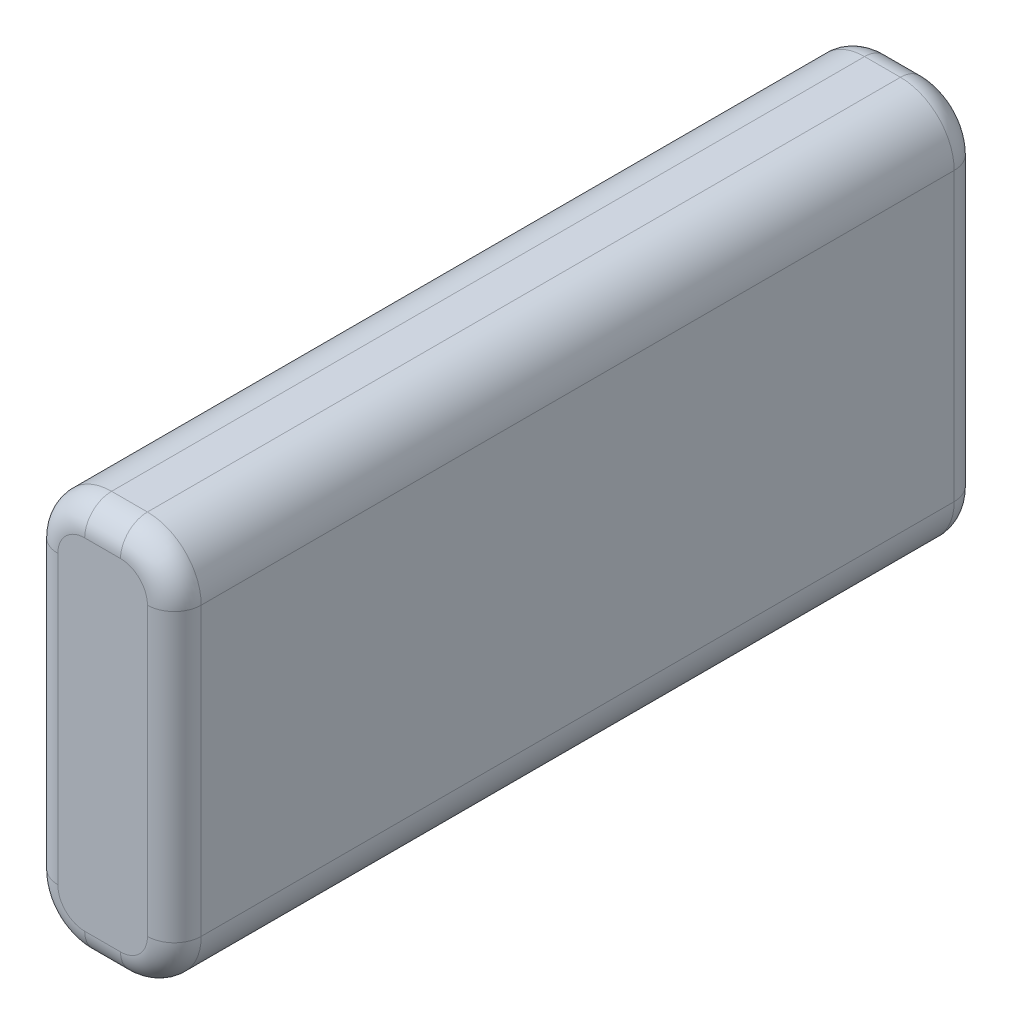
ISO-10303-21;
HEADER;
FILE_DESCRIPTION(('STEP AP214'),'2;1');
FILE_NAME('part.step','',(''),(''),'','','');
FILE_SCHEMA(('AUTOMOTIVE_DESIGN { 1 0 10303 214 1 1 1 1 }'));
ENDSEC;
DATA;
#1=APPLICATION_CONTEXT('core data for automotive mechanical design processes');
#2=APPLICATION_PROTOCOL_DEFINITION('international standard','automotive_design',2000,#1);
#3=PRODUCT_CONTEXT('',#1,'mechanical');
#4=PRODUCT('Part','Part','',(#3));
#5=PRODUCT_RELATED_PRODUCT_CATEGORY('part','',(#4));
#6=PRODUCT_DEFINITION_FORMATION('','',#4);
#7=PRODUCT_DEFINITION_CONTEXT('part definition',#1,'design');
#8=PRODUCT_DEFINITION('design','',#6,#7);
#9=PRODUCT_DEFINITION_SHAPE('','',#8);
#10=(LENGTH_UNIT() NAMED_UNIT(*) SI_UNIT(.MILLI.,.METRE.));
#11=(NAMED_UNIT(*) PLANE_ANGLE_UNIT() SI_UNIT($,.RADIAN.));
#12=(NAMED_UNIT(*) SI_UNIT($,.STERADIAN.) SOLID_ANGLE_UNIT());
#13=UNCERTAINTY_MEASURE_WITH_UNIT(LENGTH_MEASURE(1.E-05),#10,'distance_accuracy_value','');
#14=(GEOMETRIC_REPRESENTATION_CONTEXT(3) GLOBAL_UNCERTAINTY_ASSIGNED_CONTEXT((#13)) GLOBAL_UNIT_ASSIGNED_CONTEXT((#10,
#11,#12)) REPRESENTATION_CONTEXT('',''));
#15=CARTESIAN_POINT('',(0.,0.,0.));
#16=DIRECTION('',(0.,0.,1.));
#17=DIRECTION('',(1.,0.,0.));
#18=AXIS2_PLACEMENT_3D('',#15,#16,#17);
#19=CARTESIAN_POINT('',(-2.,-16.,45.));
#20=DIRECTION('',(0.,0.,-1.));
#21=DIRECTION('',(-1.,0.,0.));
#22=AXIS2_PLACEMENT_3D('',#19,#20,#21);
#23=CYLINDRICAL_SURFACE('',#22,6.);
#24=DIRECTION('',(0.,0.,-1.));
#25=VECTOR('',#24,1.);
#26=CARTESIAN_POINT('',(-2.,-22.,45.));
#27=LINE('',#26,#25);
#28=CARTESIAN_POINT('',(-2.,-22.,42.));
#29=VERTEX_POINT('',#28);
#30=CARTESIAN_POINT('',(-2.,-22.,-42.));
#31=VERTEX_POINT('',#30);
#32=EDGE_CURVE('E173',#29,#31,#27,.T.);
#33=ORIENTED_EDGE('',*,*,#32,.F.);
#34=CARTESIAN_POINT('',(-2.,-16.,42.));
#35=DIRECTION('',(0.,0.,1.));
#36=DIRECTION('',(1.,0.,0.));
#37=AXIS2_PLACEMENT_3D('',#34,#35,#36);
#38=CIRCLE('',#37,6.);
#39=CARTESIAN_POINT('',(-8.,-16.,42.));
#40=VERTEX_POINT('',#39);
#41=EDGE_CURVE('E165',#29,#40,#38,.F.);
#42=ORIENTED_EDGE('',*,*,#41,.T.);
#43=DIRECTION('',(0.,0.,-1.));
#44=VECTOR('',#43,1.);
#45=CARTESIAN_POINT('',(-8.,-16.,45.));
#46=LINE('',#45,#44);
#47=CARTESIAN_POINT('',(-8.,-16.,-42.));
#48=VERTEX_POINT('',#47);
#49=EDGE_CURVE('E255',#40,#48,#46,.T.);
#50=ORIENTED_EDGE('',*,*,#49,.T.);
#51=CARTESIAN_POINT('',(-2.,-16.,-42.));
#52=DIRECTION('',(0.,0.,1.));
#53=DIRECTION('',(1.,0.,0.));
#54=AXIS2_PLACEMENT_3D('',#51,#52,#53);
#55=CIRCLE('',#54,6.);
#56=EDGE_CURVE('E194',#48,#31,#55,.T.);
#57=ORIENTED_EDGE('',*,*,#56,.T.);
#58=EDGE_LOOP('',(#33,#42,#50,#57));
#59=FACE_BOUND('',#58,.T.);
#60=ADVANCED_FACE('F39',(#59),#23,.T.);
#61=CARTESIAN_POINT('',(-2.,-22.,45.));
#62=DIRECTION('',(0.,1.,0.));
#63=DIRECTION('',(0.,0.,1.));
#64=AXIS2_PLACEMENT_3D('',#61,#62,#63);
#65=PLANE('',#64);
#66=ORIENTED_EDGE('',*,*,#32,.T.);
#67=DIRECTION('',(1.,0.,0.));
#68=VECTOR('',#67,1.);
#69=CARTESIAN_POINT('',(-2.,-22.,-42.));
#70=LINE('',#69,#68);
#71=CARTESIAN_POINT('',(2.,-22.,-42.));
#72=VERTEX_POINT('',#71);
#73=EDGE_CURVE('E227',#31,#72,#70,.T.);
#74=ORIENTED_EDGE('',*,*,#73,.T.);
#75=DIRECTION('',(0.,0.,-1.));
#76=VECTOR('',#75,1.);
#77=CARTESIAN_POINT('',(2.,-22.,45.));
#78=LINE('',#77,#76);
#79=CARTESIAN_POINT('',(2.,-22.,42.));
#80=VERTEX_POINT('',#79);
#81=EDGE_CURVE('E309',#80,#72,#78,.T.);
#82=ORIENTED_EDGE('',*,*,#81,.F.);
#83=DIRECTION('',(1.,0.,0.));
#84=VECTOR('',#83,1.);
#85=CARTESIAN_POINT('',(-2.,-22.,42.));
#86=LINE('',#85,#84);
#87=EDGE_CURVE('E221',#80,#29,#86,.F.);
#88=ORIENTED_EDGE('',*,*,#87,.T.);
#89=EDGE_LOOP('',(#66,#74,#82,#88));
#90=FACE_BOUND('',#89,.T.);
#91=ADVANCED_FACE('F321',(#90),#65,.F.);
#92=CARTESIAN_POINT('',(2.,-16.,45.));
#93=DIRECTION('',(0.,0.,-1.));
#94=DIRECTION('',(-1.,0.,0.));
#95=AXIS2_PLACEMENT_3D('',#92,#93,#94);
#96=CYLINDRICAL_SURFACE('',#95,6.);
#97=DIRECTION('',(0.,0.,-1.));
#98=VECTOR('',#97,1.);
#99=CARTESIAN_POINT('',(8.,-16.,45.));
#100=LINE('',#99,#98);
#101=CARTESIAN_POINT('',(8.,-16.,42.));
#102=VERTEX_POINT('',#101);
#103=CARTESIAN_POINT('',(8.,-16.,-42.));
#104=VERTEX_POINT('',#103);
#105=EDGE_CURVE('E302',#102,#104,#100,.T.);
#106=ORIENTED_EDGE('',*,*,#105,.F.);
#107=CARTESIAN_POINT('',(2.,-16.,42.));
#108=DIRECTION('',(0.,0.,1.));
#109=DIRECTION('',(1.,0.,0.));
#110=AXIS2_PLACEMENT_3D('',#107,#108,#109);
#111=CIRCLE('',#110,6.);
#112=EDGE_CURVE('E210',#102,#80,#111,.F.);
#113=ORIENTED_EDGE('',*,*,#112,.T.);
#114=ORIENTED_EDGE('',*,*,#81,.T.);
#115=CARTESIAN_POINT('',(2.,-16.,-42.));
#116=DIRECTION('',(0.,0.,1.));
#117=DIRECTION('',(1.,0.,0.));
#118=AXIS2_PLACEMENT_3D('',#115,#116,#117);
#119=CIRCLE('',#118,6.);
#120=EDGE_CURVE('E202',#72,#104,#119,.T.);
#121=ORIENTED_EDGE('',*,*,#120,.T.);
#122=EDGE_LOOP('',(#106,#113,#114,#121));
#123=FACE_BOUND('',#122,.T.);
#124=ADVANCED_FACE('F362',(#123),#96,.T.);
#125=CARTESIAN_POINT('',(8.,-16.,45.));
#126=DIRECTION('',(-1.,0.,0.));
#127=DIRECTION('',(0.,0.,1.));
#128=AXIS2_PLACEMENT_3D('',#125,#126,#127);
#129=PLANE('',#128);
#130=DIRECTION('',(0.,0.,-1.));
#131=VECTOR('',#130,1.);
#132=CARTESIAN_POINT('',(8.,16.,45.));
#133=LINE('',#132,#131);
#134=CARTESIAN_POINT('',(8.,16.,42.));
#135=VERTEX_POINT('',#134);
#136=CARTESIAN_POINT('',(8.,16.,-42.));
#137=VERTEX_POINT('',#136);
#138=EDGE_CURVE('E296',#135,#137,#133,.T.);
#139=ORIENTED_EDGE('',*,*,#138,.F.);
#140=DIRECTION('',(0.,1.,0.));
#141=VECTOR('',#140,1.);
#142=CARTESIAN_POINT('',(8.,-16.,42.));
#143=LINE('',#142,#141);
#144=EDGE_CURVE('E233',#135,#102,#143,.F.);
#145=ORIENTED_EDGE('',*,*,#144,.T.);
#146=ORIENTED_EDGE('',*,*,#105,.T.);
#147=DIRECTION('',(0.,1.,0.));
#148=VECTOR('',#147,1.);
#149=CARTESIAN_POINT('',(8.,-16.,-42.));
#150=LINE('',#149,#148);
#151=EDGE_CURVE('E232',#104,#137,#150,.T.);
#152=ORIENTED_EDGE('',*,*,#151,.T.);
#153=EDGE_LOOP('',(#139,#145,#146,#152));
#154=FACE_BOUND('',#153,.T.);
#155=ADVANCED_FACE('F299',(#154),#129,.F.);
#156=CARTESIAN_POINT('',(2.,16.,45.));
#157=DIRECTION('',(0.,0.,-1.));
#158=DIRECTION('',(-1.,0.,0.));
#159=AXIS2_PLACEMENT_3D('',#156,#157,#158);
#160=CYLINDRICAL_SURFACE('',#159,6.);
#161=DIRECTION('',(0.,0.,-1.));
#162=VECTOR('',#161,1.);
#163=CARTESIAN_POINT('',(2.,22.,45.));
#164=LINE('',#163,#162);
#165=CARTESIAN_POINT('',(2.,22.,42.));
#166=VERTEX_POINT('',#165);
#167=CARTESIAN_POINT('',(2.,22.,-42.));
#168=VERTEX_POINT('',#167);
#169=EDGE_CURVE('E306',#166,#168,#164,.T.);
#170=ORIENTED_EDGE('',*,*,#169,.F.);
#171=CARTESIAN_POINT('',(2.,16.,42.));
#172=DIRECTION('',(0.,0.,1.));
#173=DIRECTION('',(1.,0.,0.));
#174=AXIS2_PLACEMENT_3D('',#171,#172,#173);
#175=CIRCLE('',#174,6.);
#176=EDGE_CURVE('E201',#166,#135,#175,.F.);
#177=ORIENTED_EDGE('',*,*,#176,.T.);
#178=ORIENTED_EDGE('',*,*,#138,.T.);
#179=CARTESIAN_POINT('',(2.,16.,-42.));
#180=DIRECTION('',(0.,0.,1.));
#181=DIRECTION('',(1.,0.,0.));
#182=AXIS2_PLACEMENT_3D('',#179,#180,#181);
#183=CIRCLE('',#182,6.);
#184=EDGE_CURVE('E199',#137,#168,#183,.T.);
#185=ORIENTED_EDGE('',*,*,#184,.T.);
#186=EDGE_LOOP('',(#170,#177,#178,#185));
#187=FACE_BOUND('',#186,.T.);
#188=ADVANCED_FACE('F305',(#187),#160,.T.);
#189=CARTESIAN_POINT('',(2.,22.,45.));
#190=DIRECTION('',(0.,-1.,0.));
#191=DIRECTION('',(0.,0.,-1.));
#192=AXIS2_PLACEMENT_3D('',#189,#190,#191);
#193=PLANE('',#192);
#194=DIRECTION('',(0.,0.,-1.));
#195=VECTOR('',#194,1.);
#196=CARTESIAN_POINT('',(-2.,22.,45.));
#197=LINE('',#196,#195);
#198=CARTESIAN_POINT('',(-2.,22.,42.));
#199=VERTEX_POINT('',#198);
#200=CARTESIAN_POINT('',(-2.,22.,-42.));
#201=VERTEX_POINT('',#200);
#202=EDGE_CURVE('E315',#199,#201,#197,.T.);
#203=ORIENTED_EDGE('',*,*,#202,.F.);
#204=DIRECTION('',(-1.,0.,0.));
#205=VECTOR('',#204,1.);
#206=CARTESIAN_POINT('',(2.,22.,42.));
#207=LINE('',#206,#205);
#208=EDGE_CURVE('E11',#199,#166,#207,.F.);
#209=ORIENTED_EDGE('',*,*,#208,.T.);
#210=ORIENTED_EDGE('',*,*,#169,.T.);
#211=DIRECTION('',(-1.,0.,0.));
#212=VECTOR('',#211,1.);
#213=CARTESIAN_POINT('',(2.,22.,-42.));
#214=LINE('',#213,#212);
#215=EDGE_CURVE('E48',#168,#201,#214,.T.);
#216=ORIENTED_EDGE('',*,*,#215,.T.);
#217=EDGE_LOOP('',(#203,#209,#210,#216));
#218=FACE_BOUND('',#217,.T.);
#219=ADVANCED_FACE('F528',(#218),#193,.F.);
#220=CARTESIAN_POINT('',(-2.,16.,45.));
#221=DIRECTION('',(0.,0.,-1.));
#222=DIRECTION('',(-1.,0.,0.));
#223=AXIS2_PLACEMENT_3D('',#220,#221,#222);
#224=CYLINDRICAL_SURFACE('',#223,6.);
#225=DIRECTION('',(0.,0.,-1.));
#226=VECTOR('',#225,1.);
#227=CARTESIAN_POINT('',(-8.,16.,45.));
#228=LINE('',#227,#226);
#229=CARTESIAN_POINT('',(-8.,16.,42.));
#230=VERTEX_POINT('',#229);
#231=CARTESIAN_POINT('',(-8.,16.,-42.));
#232=VERTEX_POINT('',#231);
#233=EDGE_CURVE('E330',#230,#232,#228,.T.);
#234=ORIENTED_EDGE('',*,*,#233,.F.);
#235=CARTESIAN_POINT('',(-2.,16.,42.));
#236=DIRECTION('',(0.,0.,1.));
#237=DIRECTION('',(1.,0.,0.));
#238=AXIS2_PLACEMENT_3D('',#235,#236,#237);
#239=CIRCLE('',#238,6.);
#240=EDGE_CURVE('E196',#230,#199,#239,.F.);
#241=ORIENTED_EDGE('',*,*,#240,.T.);
#242=ORIENTED_EDGE('',*,*,#202,.T.);
#243=CARTESIAN_POINT('',(-2.,16.,-42.));
#244=DIRECTION('',(0.,0.,1.));
#245=DIRECTION('',(1.,0.,0.));
#246=AXIS2_PLACEMENT_3D('',#243,#244,#245);
#247=CIRCLE('',#246,6.);
#248=EDGE_CURVE('E198',#201,#232,#247,.T.);
#249=ORIENTED_EDGE('',*,*,#248,.T.);
#250=EDGE_LOOP('',(#234,#241,#242,#249));
#251=FACE_BOUND('',#250,.T.);
#252=ADVANCED_FACE('F337',(#251),#224,.T.);
#253=CARTESIAN_POINT('',(-8.,16.,45.));
#254=DIRECTION('',(1.,0.,0.));
#255=DIRECTION('',(0.,0.,-1.));
#256=AXIS2_PLACEMENT_3D('',#253,#254,#255);
#257=PLANE('',#256);
#258=ORIENTED_EDGE('',*,*,#233,.T.);
#259=DIRECTION('',(0.,-1.,0.));
#260=VECTOR('',#259,1.);
#261=CARTESIAN_POINT('',(-8.,16.,-42.));
#262=LINE('',#261,#260);
#263=EDGE_CURVE('E228',#232,#48,#262,.T.);
#264=ORIENTED_EDGE('',*,*,#263,.T.);
#265=ORIENTED_EDGE('',*,*,#49,.F.);
#266=DIRECTION('',(0.,-1.,0.));
#267=VECTOR('',#266,1.);
#268=CARTESIAN_POINT('',(-8.,16.,42.));
#269=LINE('',#268,#267);
#270=EDGE_CURVE('E229',#40,#230,#269,.F.);
#271=ORIENTED_EDGE('',*,*,#270,.T.);
#272=EDGE_LOOP('',(#258,#264,#265,#271));
#273=FACE_BOUND('',#272,.T.);
#274=ADVANCED_FACE('F409',(#273),#257,.F.);
#275=CARTESIAN_POINT('',(-2.,-16.,45.));
#276=DIRECTION('',(0.,0.,1.));
#277=DIRECTION('',(1.,0.,0.));
#278=AXIS2_PLACEMENT_3D('',#275,#276,#277);
#279=PLANE('',#278);
#280=CARTESIAN_POINT('',(2.,16.,45.));
#281=DIRECTION('',(0.,0.,1.));
#282=DIRECTION('',(1.,0.,0.));
#283=AXIS2_PLACEMENT_3D('',#280,#281,#282);
#284=CIRCLE('',#283,3.);
#285=CARTESIAN_POINT('',(5.,16.,45.));
#286=VERTEX_POINT('',#285);
#287=CARTESIAN_POINT('',(2.,19.,45.));
#288=VERTEX_POINT('',#287);
#289=EDGE_CURVE('E190',#286,#288,#284,.T.);
#290=ORIENTED_EDGE('',*,*,#289,.T.);
#291=DIRECTION('',(-1.,0.,0.));
#292=VECTOR('',#291,1.);
#293=CARTESIAN_POINT('',(-2.,19.,45.));
#294=LINE('',#293,#292);
#295=CARTESIAN_POINT('',(-2.,19.,45.));
#296=VERTEX_POINT('',#295);
#297=EDGE_CURVE('E191',#288,#296,#294,.T.);
#298=ORIENTED_EDGE('',*,*,#297,.T.);
#299=CARTESIAN_POINT('',(-2.,16.,45.));
#300=DIRECTION('',(0.,0.,1.));
#301=DIRECTION('',(1.,0.,0.));
#302=AXIS2_PLACEMENT_3D('',#299,#300,#301);
#303=CIRCLE('',#302,3.);
#304=CARTESIAN_POINT('',(-5.,16.,45.));
#305=VERTEX_POINT('',#304);
#306=EDGE_CURVE('E186',#296,#305,#303,.T.);
#307=ORIENTED_EDGE('',*,*,#306,.T.);
#308=DIRECTION('',(0.,-1.,0.));
#309=VECTOR('',#308,1.);
#310=CARTESIAN_POINT('',(-5.,-16.,45.));
#311=LINE('',#310,#309);
#312=CARTESIAN_POINT('',(-5.,-16.,45.));
#313=VERTEX_POINT('',#312);
#314=EDGE_CURVE('E178',#305,#313,#311,.T.);
#315=ORIENTED_EDGE('',*,*,#314,.T.);
#316=CARTESIAN_POINT('',(-2.,-16.,45.));
#317=DIRECTION('',(0.,0.,1.));
#318=DIRECTION('',(1.,0.,0.));
#319=AXIS2_PLACEMENT_3D('',#316,#317,#318);
#320=CIRCLE('',#319,3.);
#321=CARTESIAN_POINT('',(-2.,-19.,45.));
#322=VERTEX_POINT('',#321);
#323=EDGE_CURVE('E159',#313,#322,#320,.T.);
#324=ORIENTED_EDGE('',*,*,#323,.T.);
#325=DIRECTION('',(1.,0.,0.));
#326=VECTOR('',#325,1.);
#327=CARTESIAN_POINT('',(2.,-19.,45.));
#328=LINE('',#327,#326);
#329=CARTESIAN_POINT('',(2.,-19.,45.));
#330=VERTEX_POINT('',#329);
#331=EDGE_CURVE('E169',#322,#330,#328,.T.);
#332=ORIENTED_EDGE('',*,*,#331,.T.);
#333=CARTESIAN_POINT('',(2.,-16.,45.));
#334=DIRECTION('',(0.,0.,1.));
#335=DIRECTION('',(1.,0.,0.));
#336=AXIS2_PLACEMENT_3D('',#333,#334,#335);
#337=CIRCLE('',#336,3.);
#338=CARTESIAN_POINT('',(5.,-16.,45.));
#339=VERTEX_POINT('',#338);
#340=EDGE_CURVE('E171',#330,#339,#337,.T.);
#341=ORIENTED_EDGE('',*,*,#340,.T.);
#342=DIRECTION('',(0.,1.,0.));
#343=VECTOR('',#342,1.);
#344=CARTESIAN_POINT('',(5.,16.,45.));
#345=LINE('',#344,#343);
#346=EDGE_CURVE('E185',#339,#286,#345,.T.);
#347=ORIENTED_EDGE('',*,*,#346,.T.);
#348=EDGE_LOOP('',(#290,#298,#307,#315,#324,#332,#341,#347));
#349=FACE_BOUND('',#348,.T.);
#350=ADVANCED_FACE('F177',(#349),#279,.T.);
#351=CARTESIAN_POINT('',(-2.,-16.,-45.));
#352=DIRECTION('',(0.,0.,1.));
#353=DIRECTION('',(1.,0.,0.));
#354=AXIS2_PLACEMENT_3D('',#351,#352,#353);
#355=PLANE('',#354);
#356=CARTESIAN_POINT('',(2.,16.,-45.));
#357=DIRECTION('',(0.,0.,1.));
#358=DIRECTION('',(1.,0.,0.));
#359=AXIS2_PLACEMENT_3D('',#356,#357,#358);
#360=CIRCLE('',#359,3.);
#361=CARTESIAN_POINT('',(2.,19.,-45.));
#362=VERTEX_POINT('',#361);
#363=CARTESIAN_POINT('',(5.,16.,-45.));
#364=VERTEX_POINT('',#363);
#365=EDGE_CURVE('E222',#362,#364,#360,.F.);
#366=ORIENTED_EDGE('',*,*,#365,.T.);
#367=DIRECTION('',(0.,1.,0.));
#368=VECTOR('',#367,1.);
#369=CARTESIAN_POINT('',(5.,-16.,-45.));
#370=LINE('',#369,#368);
#371=CARTESIAN_POINT('',(5.,-16.,-45.));
#372=VERTEX_POINT('',#371);
#373=EDGE_CURVE('E64',#364,#372,#370,.F.);
#374=ORIENTED_EDGE('',*,*,#373,.T.);
#375=CARTESIAN_POINT('',(2.,-16.,-45.));
#376=DIRECTION('',(0.,0.,1.));
#377=DIRECTION('',(1.,0.,0.));
#378=AXIS2_PLACEMENT_3D('',#375,#376,#377);
#379=CIRCLE('',#378,3.);
#380=CARTESIAN_POINT('',(2.,-19.,-45.));
#381=VERTEX_POINT('',#380);
#382=EDGE_CURVE('E218',#372,#381,#379,.F.);
#383=ORIENTED_EDGE('',*,*,#382,.T.);
#384=DIRECTION('',(1.,0.,0.));
#385=VECTOR('',#384,1.);
#386=CARTESIAN_POINT('',(-2.,-19.,-45.));
#387=LINE('',#386,#385);
#388=CARTESIAN_POINT('',(-2.,-19.,-45.));
#389=VERTEX_POINT('',#388);
#390=EDGE_CURVE('E220',#381,#389,#387,.F.);
#391=ORIENTED_EDGE('',*,*,#390,.T.);
#392=CARTESIAN_POINT('',(-2.,-16.,-45.));
#393=DIRECTION('',(0.,0.,1.));
#394=DIRECTION('',(1.,0.,0.));
#395=AXIS2_PLACEMENT_3D('',#392,#393,#394);
#396=CIRCLE('',#395,3.);
#397=CARTESIAN_POINT('',(-5.,-16.,-45.));
#398=VERTEX_POINT('',#397);
#399=EDGE_CURVE('E214',#389,#398,#396,.F.);
#400=ORIENTED_EDGE('',*,*,#399,.T.);
#401=DIRECTION('',(0.,-1.,0.));
#402=VECTOR('',#401,1.);
#403=CARTESIAN_POINT('',(-5.,-16.,-45.));
#404=LINE('',#403,#402);
#405=CARTESIAN_POINT('',(-5.,16.,-45.));
#406=VERTEX_POINT('',#405);
#407=EDGE_CURVE('E213',#398,#406,#404,.F.);
#408=ORIENTED_EDGE('',*,*,#407,.T.);
#409=CARTESIAN_POINT('',(-2.,16.,-45.));
#410=DIRECTION('',(0.,0.,1.));
#411=DIRECTION('',(1.,0.,0.));
#412=AXIS2_PLACEMENT_3D('',#409,#410,#411);
#413=CIRCLE('',#412,3.);
#414=CARTESIAN_POINT('',(-2.,19.,-45.));
#415=VERTEX_POINT('',#414);
#416=EDGE_CURVE('E211',#406,#415,#413,.F.);
#417=ORIENTED_EDGE('',*,*,#416,.T.);
#418=DIRECTION('',(-1.,0.,0.));
#419=VECTOR('',#418,1.);
#420=CARTESIAN_POINT('',(-2.,19.,-45.));
#421=LINE('',#420,#419);
#422=EDGE_CURVE('E207',#415,#362,#421,.F.);
#423=ORIENTED_EDGE('',*,*,#422,.T.);
#424=EDGE_LOOP('',(#366,#374,#383,#391,#400,#408,#417,#423));
#425=FACE_BOUND('',#424,.T.);
#426=ADVANCED_FACE('F283',(#425),#355,.F.);
#427=CARTESIAN_POINT('',(2.,16.,42.));
#428=DIRECTION('',(0.,0.,1.));
#429=DIRECTION('',(1.,0.,0.));
#430=AXIS2_PLACEMENT_3D('',#427,#428,#429);
#431=DEGENERATE_TOROIDAL_SURFACE('',#430,3.,3.,.T.);
#432=CARTESIAN_POINT('',(5.,16.,42.));
#433=DIRECTION('',(0.,-1.,0.));
#434=DIRECTION('',(0.,0.,-1.));
#435=AXIS2_PLACEMENT_3D('',#432,#433,#434);
#436=CIRCLE('',#435,3.);
#437=EDGE_CURVE('E249',#135,#286,#436,.T.);
#438=ORIENTED_EDGE('',*,*,#437,.F.);
#439=ORIENTED_EDGE('',*,*,#176,.F.);
#440=CARTESIAN_POINT('',(2.,19.,42.));
#441=DIRECTION('',(-1.,0.,0.));
#442=DIRECTION('',(0.,-1.,0.));
#443=AXIS2_PLACEMENT_3D('',#440,#441,#442);
#444=CIRCLE('',#443,3.);
#445=EDGE_CURVE('E253',#288,#166,#444,.T.);
#446=ORIENTED_EDGE('',*,*,#445,.F.);
#447=ORIENTED_EDGE('',*,*,#289,.F.);
#448=EDGE_LOOP('',(#438,#439,#446,#447));
#449=FACE_BOUND('',#448,.T.);
#450=ADVANCED_FACE('F389',(#449),#431,.T.);
#451=CARTESIAN_POINT('',(-2.,19.,42.));
#452=DIRECTION('',(1.,0.,0.));
#453=DIRECTION('',(0.,0.,-1.));
#454=AXIS2_PLACEMENT_3D('',#451,#452,#453);
#455=CYLINDRICAL_SURFACE('',#454,3.);
#456=ORIENTED_EDGE('',*,*,#445,.T.);
#457=ORIENTED_EDGE('',*,*,#208,.F.);
#458=CARTESIAN_POINT('',(-2.,19.,42.));
#459=DIRECTION('',(-1.,0.,0.));
#460=DIRECTION('',(0.,-1.,0.));
#461=AXIS2_PLACEMENT_3D('',#458,#459,#460);
#462=CIRCLE('',#461,3.);
#463=EDGE_CURVE('E243',#296,#199,#462,.T.);
#464=ORIENTED_EDGE('',*,*,#463,.F.);
#465=ORIENTED_EDGE('',*,*,#297,.F.);
#466=EDGE_LOOP('',(#456,#457,#464,#465));
#467=FACE_BOUND('',#466,.T.);
#468=ADVANCED_FACE('F384',(#467),#455,.T.);
#469=CARTESIAN_POINT('',(5.,-16.,42.));
#470=DIRECTION('',(0.,-1.,0.));
#471=DIRECTION('',(0.,0.,-1.));
#472=AXIS2_PLACEMENT_3D('',#469,#470,#471);
#473=CYLINDRICAL_SURFACE('',#472,3.);
#474=ORIENTED_EDGE('',*,*,#437,.T.);
#475=ORIENTED_EDGE('',*,*,#346,.F.);
#476=CARTESIAN_POINT('',(5.,-16.,42.));
#477=DIRECTION('',(0.,-1.,0.));
#478=DIRECTION('',(0.,0.,-1.));
#479=AXIS2_PLACEMENT_3D('',#476,#477,#478);
#480=CIRCLE('',#479,3.);
#481=EDGE_CURVE('E245',#102,#339,#480,.T.);
#482=ORIENTED_EDGE('',*,*,#481,.F.);
#483=ORIENTED_EDGE('',*,*,#144,.F.);
#484=EDGE_LOOP('',(#474,#475,#482,#483));
#485=FACE_BOUND('',#484,.T.);
#486=ADVANCED_FACE('F381',(#485),#473,.T.);
#487=CARTESIAN_POINT('',(-2.,16.,42.));
#488=DIRECTION('',(0.,0.,1.));
#489=DIRECTION('',(1.,0.,0.));
#490=AXIS2_PLACEMENT_3D('',#487,#488,#489);
#491=DEGENERATE_TOROIDAL_SURFACE('',#490,3.,3.,.T.);
#492=ORIENTED_EDGE('',*,*,#463,.T.);
#493=ORIENTED_EDGE('',*,*,#240,.F.);
#494=CARTESIAN_POINT('',(-5.,16.,42.));
#495=DIRECTION('',(0.,-1.,0.));
#496=DIRECTION('',(0.,0.,-1.));
#497=AXIS2_PLACEMENT_3D('',#494,#495,#496);
#498=CIRCLE('',#497,3.);
#499=EDGE_CURVE('E239',#305,#230,#498,.T.);
#500=ORIENTED_EDGE('',*,*,#499,.F.);
#501=ORIENTED_EDGE('',*,*,#306,.F.);
#502=EDGE_LOOP('',(#492,#493,#500,#501));
#503=FACE_BOUND('',#502,.T.);
#504=ADVANCED_FACE('F380',(#503),#491,.T.);
#505=CARTESIAN_POINT('',(2.,-16.,42.));
#506=DIRECTION('',(0.,0.,1.));
#507=DIRECTION('',(1.,0.,0.));
#508=AXIS2_PLACEMENT_3D('',#505,#506,#507);
#509=DEGENERATE_TOROIDAL_SURFACE('',#508,3.,3.,.T.);
#510=ORIENTED_EDGE('',*,*,#481,.T.);
#511=ORIENTED_EDGE('',*,*,#340,.F.);
#512=CARTESIAN_POINT('',(2.,-19.,42.));
#513=DIRECTION('',(-1.,0.,0.));
#514=DIRECTION('',(0.,-1.,0.));
#515=AXIS2_PLACEMENT_3D('',#512,#513,#514);
#516=CIRCLE('',#515,3.);
#517=EDGE_CURVE('E172',#80,#330,#516,.T.);
#518=ORIENTED_EDGE('',*,*,#517,.F.);
#519=ORIENTED_EDGE('',*,*,#112,.F.);
#520=EDGE_LOOP('',(#510,#511,#518,#519));
#521=FACE_BOUND('',#520,.T.);
#522=ADVANCED_FACE('F373',(#521),#509,.T.);
#523=CARTESIAN_POINT('',(-5.,-16.,42.));
#524=DIRECTION('',(0.,1.,0.));
#525=DIRECTION('',(0.,0.,1.));
#526=AXIS2_PLACEMENT_3D('',#523,#524,#525);
#527=CYLINDRICAL_SURFACE('',#526,3.);
#528=ORIENTED_EDGE('',*,*,#499,.T.);
#529=ORIENTED_EDGE('',*,*,#270,.F.);
#530=CARTESIAN_POINT('',(-5.,-16.,42.));
#531=DIRECTION('',(0.,-1.,0.));
#532=DIRECTION('',(0.,0.,-1.));
#533=AXIS2_PLACEMENT_3D('',#530,#531,#532);
#534=CIRCLE('',#533,3.);
#535=EDGE_CURVE('E164',#313,#40,#534,.T.);
#536=ORIENTED_EDGE('',*,*,#535,.F.);
#537=ORIENTED_EDGE('',*,*,#314,.F.);
#538=EDGE_LOOP('',(#528,#529,#536,#537));
#539=FACE_BOUND('',#538,.T.);
#540=ADVANCED_FACE('F367',(#539),#527,.T.);
#541=CARTESIAN_POINT('',(-2.,-19.,42.));
#542=DIRECTION('',(-1.,0.,0.));
#543=DIRECTION('',(0.,0.,1.));
#544=AXIS2_PLACEMENT_3D('',#541,#542,#543);
#545=CYLINDRICAL_SURFACE('',#544,3.);
#546=ORIENTED_EDGE('',*,*,#517,.T.);
#547=ORIENTED_EDGE('',*,*,#331,.F.);
#548=CARTESIAN_POINT('',(-2.,-19.,42.));
#549=DIRECTION('',(-1.,0.,0.));
#550=DIRECTION('',(0.,0.,1.));
#551=AXIS2_PLACEMENT_3D('',#548,#549,#550);
#552=CIRCLE('',#551,3.);
#553=EDGE_CURVE('E156',#29,#322,#552,.T.);
#554=ORIENTED_EDGE('',*,*,#553,.F.);
#555=ORIENTED_EDGE('',*,*,#87,.F.);
#556=EDGE_LOOP('',(#546,#547,#554,#555));
#557=FACE_BOUND('',#556,.T.);
#558=ADVANCED_FACE('F166',(#557),#545,.T.);
#559=CARTESIAN_POINT('',(-2.,-16.,42.));
#560=DIRECTION('',(0.,0.,1.));
#561=DIRECTION('',(1.,0.,0.));
#562=AXIS2_PLACEMENT_3D('',#559,#560,#561);
#563=DEGENERATE_TOROIDAL_SURFACE('',#562,3.,3.,.T.);
#564=ORIENTED_EDGE('',*,*,#535,.T.);
#565=ORIENTED_EDGE('',*,*,#41,.F.);
#566=ORIENTED_EDGE('',*,*,#553,.T.);
#567=ORIENTED_EDGE('',*,*,#323,.F.);
#568=EDGE_LOOP('',(#564,#565,#566,#567));
#569=FACE_BOUND('',#568,.T.);
#570=ADVANCED_FACE('F158',(#569),#563,.T.);
#571=CARTESIAN_POINT('',(-2.,-16.,-42.));
#572=DIRECTION('',(0.,0.,1.));
#573=DIRECTION('',(1.,0.,0.));
#574=AXIS2_PLACEMENT_3D('',#571,#572,#573);
#575=DEGENERATE_TOROIDAL_SURFACE('',#574,3.,3.,.T.);
#576=CARTESIAN_POINT('',(-5.,-16.,-42.));
#577=DIRECTION('',(0.,1.,0.));
#578=DIRECTION('',(0.,0.,1.));
#579=AXIS2_PLACEMENT_3D('',#576,#577,#578);
#580=CIRCLE('',#579,3.);
#581=EDGE_CURVE('E267',#398,#48,#580,.T.);
#582=ORIENTED_EDGE('',*,*,#581,.F.);
#583=ORIENTED_EDGE('',*,*,#399,.F.);
#584=CARTESIAN_POINT('',(-2.,-19.,-42.));
#585=DIRECTION('',(1.,0.,0.));
#586=DIRECTION('',(0.,0.,-1.));
#587=AXIS2_PLACEMENT_3D('',#584,#585,#586);
#588=CIRCLE('',#587,3.);
#589=EDGE_CURVE('E43',#31,#389,#588,.T.);
#590=ORIENTED_EDGE('',*,*,#589,.F.);
#591=ORIENTED_EDGE('',*,*,#56,.F.);
#592=EDGE_LOOP('',(#582,#583,#590,#591));
#593=FACE_BOUND('',#592,.T.);
#594=ADVANCED_FACE('F41',(#593),#575,.T.);
#595=CARTESIAN_POINT('',(-2.,-19.,-42.));
#596=DIRECTION('',(1.,0.,0.));
#597=DIRECTION('',(0.,0.,-1.));
#598=AXIS2_PLACEMENT_3D('',#595,#596,#597);
#599=CYLINDRICAL_SURFACE('',#598,3.);
#600=ORIENTED_EDGE('',*,*,#589,.T.);
#601=ORIENTED_EDGE('',*,*,#390,.F.);
#602=CARTESIAN_POINT('',(2.,-19.,-42.));
#603=DIRECTION('',(1.,0.,0.));
#604=DIRECTION('',(0.,0.,-1.));
#605=AXIS2_PLACEMENT_3D('',#602,#603,#604);
#606=CIRCLE('',#605,3.);
#607=EDGE_CURVE('E270',#72,#381,#606,.T.);
#608=ORIENTED_EDGE('',*,*,#607,.F.);
#609=ORIENTED_EDGE('',*,*,#73,.F.);
#610=EDGE_LOOP('',(#600,#601,#608,#609));
#611=FACE_BOUND('',#610,.T.);
#612=ADVANCED_FACE('F278',(#611),#599,.T.);
#613=CARTESIAN_POINT('',(-5.,16.,-42.));
#614=DIRECTION('',(0.,-1.,0.));
#615=DIRECTION('',(0.,0.,-1.));
#616=AXIS2_PLACEMENT_3D('',#613,#614,#615);
#617=CYLINDRICAL_SURFACE('',#616,3.);
#618=ORIENTED_EDGE('',*,*,#581,.T.);
#619=ORIENTED_EDGE('',*,*,#263,.F.);
#620=CARTESIAN_POINT('',(-5.,16.,-42.));
#621=DIRECTION('',(0.,1.,0.));
#622=DIRECTION('',(0.,0.,1.));
#623=AXIS2_PLACEMENT_3D('',#620,#621,#622);
#624=CIRCLE('',#623,3.);
#625=EDGE_CURVE('E262',#406,#232,#624,.T.);
#626=ORIENTED_EDGE('',*,*,#625,.F.);
#627=ORIENTED_EDGE('',*,*,#407,.F.);
#628=EDGE_LOOP('',(#618,#619,#626,#627));
#629=FACE_BOUND('',#628,.T.);
#630=ADVANCED_FACE('F406',(#629),#617,.T.);
#631=CARTESIAN_POINT('',(2.,-16.,-42.));
#632=DIRECTION('',(0.,0.,1.));
#633=DIRECTION('',(1.,0.,0.));
#634=AXIS2_PLACEMENT_3D('',#631,#632,#633);
#635=DEGENERATE_TOROIDAL_SURFACE('',#634,3.,3.,.T.);
#636=ORIENTED_EDGE('',*,*,#607,.T.);
#637=ORIENTED_EDGE('',*,*,#382,.F.);
#638=CARTESIAN_POINT('',(5.,-16.,-42.));
#639=DIRECTION('',(0.,1.,0.));
#640=DIRECTION('',(0.,0.,1.));
#641=AXIS2_PLACEMENT_3D('',#638,#639,#640);
#642=CIRCLE('',#641,3.);
#643=EDGE_CURVE('E261',#104,#372,#642,.T.);
#644=ORIENTED_EDGE('',*,*,#643,.F.);
#645=ORIENTED_EDGE('',*,*,#120,.F.);
#646=EDGE_LOOP('',(#636,#637,#644,#645));
#647=FACE_BOUND('',#646,.T.);
#648=ADVANCED_FACE('F288',(#647),#635,.T.);
#649=CARTESIAN_POINT('',(-2.,16.,-42.));
#650=DIRECTION('',(0.,0.,1.));
#651=DIRECTION('',(1.,0.,0.));
#652=AXIS2_PLACEMENT_3D('',#649,#650,#651);
#653=DEGENERATE_TOROIDAL_SURFACE('',#652,3.,3.,.T.);
#654=ORIENTED_EDGE('',*,*,#625,.T.);
#655=ORIENTED_EDGE('',*,*,#248,.F.);
#656=CARTESIAN_POINT('',(-2.,19.,-42.));
#657=DIRECTION('',(1.,0.,0.));
#658=DIRECTION('',(0.,1.,0.));
#659=AXIS2_PLACEMENT_3D('',#656,#657,#658);
#660=CIRCLE('',#659,3.);
#661=EDGE_CURVE('E256',#415,#201,#660,.T.);
#662=ORIENTED_EDGE('',*,*,#661,.F.);
#663=ORIENTED_EDGE('',*,*,#416,.F.);
#664=EDGE_LOOP('',(#654,#655,#662,#663));
#665=FACE_BOUND('',#664,.T.);
#666=ADVANCED_FACE('F342',(#665),#653,.T.);
#667=CARTESIAN_POINT('',(5.,-16.,-42.));
#668=DIRECTION('',(0.,1.,0.));
#669=DIRECTION('',(0.,0.,1.));
#670=AXIS2_PLACEMENT_3D('',#667,#668,#669);
#671=CYLINDRICAL_SURFACE('',#670,3.);
#672=ORIENTED_EDGE('',*,*,#643,.T.);
#673=ORIENTED_EDGE('',*,*,#373,.F.);
#674=CARTESIAN_POINT('',(5.,16.,-42.));
#675=DIRECTION('',(0.,1.,0.));
#676=DIRECTION('',(0.,0.,1.));
#677=AXIS2_PLACEMENT_3D('',#674,#675,#676);
#678=CIRCLE('',#677,3.);
#679=EDGE_CURVE('E57',#137,#364,#678,.T.);
#680=ORIENTED_EDGE('',*,*,#679,.F.);
#681=ORIENTED_EDGE('',*,*,#151,.F.);
#682=EDGE_LOOP('',(#672,#673,#680,#681));
#683=FACE_BOUND('',#682,.T.);
#684=ADVANCED_FACE('F291',(#683),#671,.T.);
#685=CARTESIAN_POINT('',(2.,19.,-42.));
#686=DIRECTION('',(-1.,0.,0.));
#687=DIRECTION('',(0.,0.,1.));
#688=AXIS2_PLACEMENT_3D('',#685,#686,#687);
#689=CYLINDRICAL_SURFACE('',#688,3.);
#690=ORIENTED_EDGE('',*,*,#661,.T.);
#691=ORIENTED_EDGE('',*,*,#215,.F.);
#692=CARTESIAN_POINT('',(2.,19.,-42.));
#693=DIRECTION('',(1.,0.,0.));
#694=DIRECTION('',(0.,1.,0.));
#695=AXIS2_PLACEMENT_3D('',#692,#693,#694);
#696=CIRCLE('',#695,3.);
#697=EDGE_CURVE('E254',#362,#168,#696,.T.);
#698=ORIENTED_EDGE('',*,*,#697,.F.);
#699=ORIENTED_EDGE('',*,*,#422,.F.);
#700=EDGE_LOOP('',(#690,#691,#698,#699));
#701=FACE_BOUND('',#700,.T.);
#702=ADVANCED_FACE('F350',(#701),#689,.T.);
#703=CARTESIAN_POINT('',(2.,16.,-42.));
#704=DIRECTION('',(0.,0.,1.));
#705=DIRECTION('',(1.,0.,0.));
#706=AXIS2_PLACEMENT_3D('',#703,#704,#705);
#707=DEGENERATE_TOROIDAL_SURFACE('',#706,3.,3.,.T.);
#708=ORIENTED_EDGE('',*,*,#679,.T.);
#709=ORIENTED_EDGE('',*,*,#365,.F.);
#710=ORIENTED_EDGE('',*,*,#697,.T.);
#711=ORIENTED_EDGE('',*,*,#184,.F.);
#712=EDGE_LOOP('',(#708,#709,#710,#711));
#713=FACE_BOUND('',#712,.T.);
#714=ADVANCED_FACE('F349',(#713),#707,.T.);
#715=CLOSED_SHELL('',(#60,#91,#124,#155,#188,#219,#252,#274,#350,#426,#450,#468,#486,#504,#522,
#540,#558,#570,#594,#612,#630,#648,#666,#684,#702,#714));
#716=MANIFOLD_SOLID_BREP('B2',#715);
#717=ADVANCED_BREP_SHAPE_REPRESENTATION('',(#18,#716),#14);
#718=SHAPE_DEFINITION_REPRESENTATION(#9,#717);
ENDSEC;
END-ISO-10303-21;
